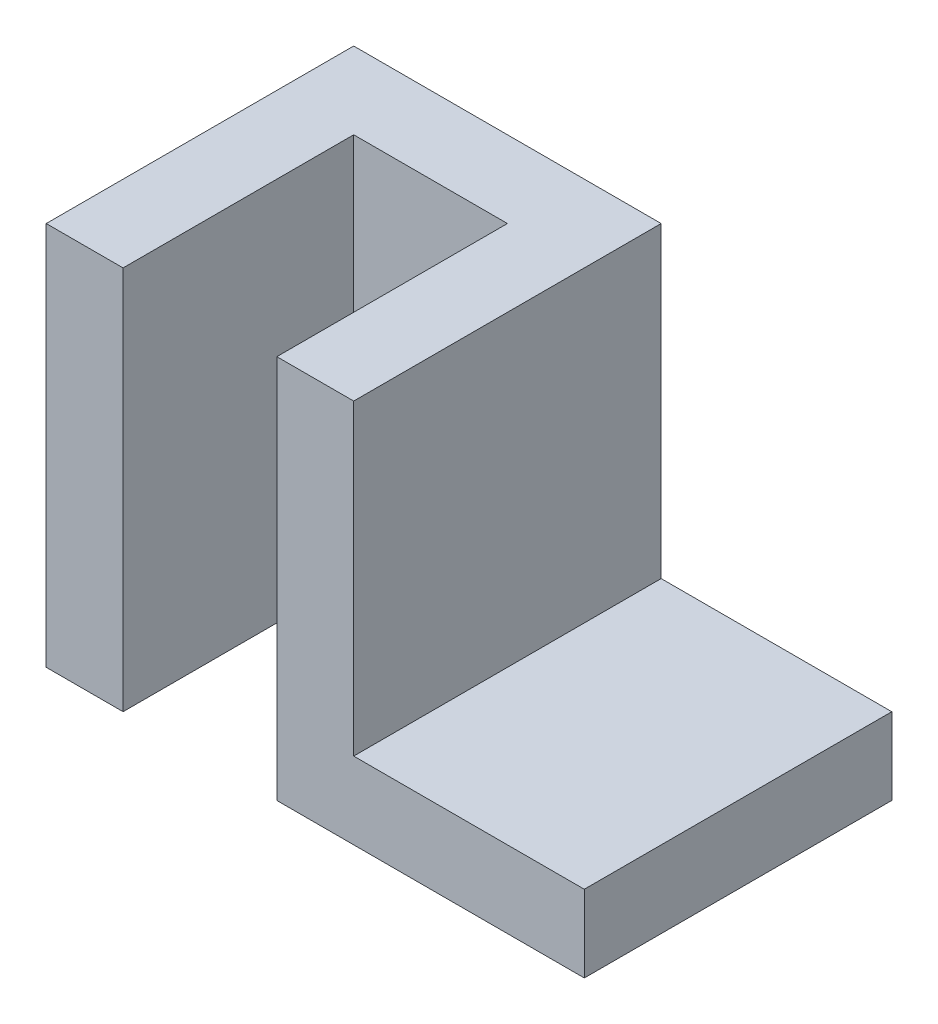
ISO-10303-21;
HEADER;
FILE_DESCRIPTION(('STEP AP214'),'2;1');
FILE_NAME('part.step','',(''),(''),'','','');
FILE_SCHEMA(('AUTOMOTIVE_DESIGN { 1 0 10303 214 1 1 1 1 }'));
ENDSEC;
DATA;
#1=APPLICATION_CONTEXT('core data for automotive mechanical design processes');
#2=APPLICATION_PROTOCOL_DEFINITION('international standard','automotive_design',2000,#1);
#3=PRODUCT_CONTEXT('',#1,'mechanical');
#4=PRODUCT('Part','Part','',(#3));
#5=PRODUCT_RELATED_PRODUCT_CATEGORY('part','',(#4));
#6=PRODUCT_DEFINITION_FORMATION('','',#4);
#7=PRODUCT_DEFINITION_CONTEXT('part definition',#1,'design');
#8=PRODUCT_DEFINITION('design','',#6,#7);
#9=PRODUCT_DEFINITION_SHAPE('','',#8);
#10=(LENGTH_UNIT() NAMED_UNIT(*) SI_UNIT(.MILLI.,.METRE.));
#11=(NAMED_UNIT(*) PLANE_ANGLE_UNIT() SI_UNIT($,.RADIAN.));
#12=(NAMED_UNIT(*) SI_UNIT($,.STERADIAN.) SOLID_ANGLE_UNIT());
#13=UNCERTAINTY_MEASURE_WITH_UNIT(LENGTH_MEASURE(1.E-05),#10,'distance_accuracy_value','');
#14=(GEOMETRIC_REPRESENTATION_CONTEXT(3) GLOBAL_UNCERTAINTY_ASSIGNED_CONTEXT((#13)) GLOBAL_UNIT_ASSIGNED_CONTEXT((#10,
#11,#12)) REPRESENTATION_CONTEXT('',''));
#15=CARTESIAN_POINT('',(0.,0.,0.));
#16=DIRECTION('',(0.,0.,1.));
#17=DIRECTION('',(1.,0.,0.));
#18=AXIS2_PLACEMENT_3D('',#15,#16,#17);
#19=CARTESIAN_POINT('',(-35.,10.,20.));
#20=DIRECTION('',(0.,0.,-1.));
#21=DIRECTION('',(-1.,0.,0.));
#22=AXIS2_PLACEMENT_3D('',#19,#20,#21);
#23=PLANE('',#22);
#24=DIRECTION('',(1.,0.,0.));
#25=VECTOR('',#24,1.);
#26=CARTESIAN_POINT('',(-35.,0.,20.));
#27=LINE('',#26,#25);
#28=CARTESIAN_POINT('',(-35.,0.,20.));
#29=VERTEX_POINT('',#28);
#30=CARTESIAN_POINT('',(-25.,0.,20.));
#31=VERTEX_POINT('',#30);
#32=EDGE_CURVE('E143',#29,#31,#27,.T.);
#33=ORIENTED_EDGE('',*,*,#32,.T.);
#34=DIRECTION('',(0.,1.,0.));
#35=VECTOR('',#34,1.);
#36=CARTESIAN_POINT('',(-25.,0.,20.));
#37=LINE('',#36,#35);
#38=CARTESIAN_POINT('',(-25.,50.,20.));
#39=VERTEX_POINT('',#38);
#40=EDGE_CURVE('E210',#31,#39,#37,.T.);
#41=ORIENTED_EDGE('',*,*,#40,.T.);
#42=DIRECTION('',(1.,0.,0.));
#43=VECTOR('',#42,1.);
#44=CARTESIAN_POINT('',(-35.,50.,20.));
#45=LINE('',#44,#43);
#46=CARTESIAN_POINT('',(-35.,50.,20.));
#47=VERTEX_POINT('',#46);
#48=EDGE_CURVE('E205',#47,#39,#45,.T.);
#49=ORIENTED_EDGE('',*,*,#48,.F.);
#50=DIRECTION('',(0.,-1.,0.));
#51=VECTOR('',#50,1.);
#52=CARTESIAN_POINT('',(-35.,10.,20.));
#53=LINE('',#52,#51);
#54=EDGE_CURVE('E11',#47,#29,#53,.T.);
#55=ORIENTED_EDGE('',*,*,#54,.T.);
#56=EDGE_LOOP('',(#33,#41,#49,#55));
#57=FACE_BOUND('',#56,.T.);
#58=ADVANCED_FACE('F39',(#57),#23,.F.);
#59=CARTESIAN_POINT('',(-35.,10.,-20.));
#60=DIRECTION('',(1.,0.,0.));
#61=DIRECTION('',(0.,0.,-1.));
#62=AXIS2_PLACEMENT_3D('',#59,#60,#61);
#63=PLANE('',#62);
#64=DIRECTION('',(0.,0.,1.));
#65=VECTOR('',#64,1.);
#66=CARTESIAN_POINT('',(-35.,0.,-20.));
#67=LINE('',#66,#65);
#68=CARTESIAN_POINT('',(-35.,0.,-20.));
#69=VERTEX_POINT('',#68);
#70=EDGE_CURVE('E144',#69,#29,#67,.T.);
#71=ORIENTED_EDGE('',*,*,#70,.T.);
#72=ORIENTED_EDGE('',*,*,#54,.F.);
#73=DIRECTION('',(0.,0.,1.));
#74=VECTOR('',#73,1.);
#75=CARTESIAN_POINT('',(-35.,50.,-20.));
#76=LINE('',#75,#74);
#77=CARTESIAN_POINT('',(-35.,50.,-20.));
#78=VERTEX_POINT('',#77);
#79=EDGE_CURVE('E209',#78,#47,#76,.T.);
#80=ORIENTED_EDGE('',*,*,#79,.F.);
#81=DIRECTION('',(0.,-1.,0.));
#82=VECTOR('',#81,1.);
#83=CARTESIAN_POINT('',(-35.,10.,-20.));
#84=LINE('',#83,#82);
#85=EDGE_CURVE('E160',#78,#69,#84,.T.);
#86=ORIENTED_EDGE('',*,*,#85,.T.);
#87=EDGE_LOOP('',(#71,#72,#80,#86));
#88=FACE_BOUND('',#87,.T.);
#89=ADVANCED_FACE('F41',(#88),#63,.F.);
#90=CARTESIAN_POINT('',(-5.,50.,20.));
#91=VERTEX_POINT('',#90);
#92=CARTESIAN_POINT('',(5.,50.,20.));
#93=VERTEX_POINT('',#92);
#94=EDGE_CURVE('E134',#91,#93,#45,.T.);
#95=ORIENTED_EDGE('',*,*,#94,.F.);
#96=DIRECTION('',(0.,1.,0.));
#97=VECTOR('',#96,1.);
#98=CARTESIAN_POINT('',(-5.,0.,20.));
#99=LINE('',#98,#97);
#100=CARTESIAN_POINT('',(-5.,0.,20.));
#101=VERTEX_POINT('',#100);
#102=EDGE_CURVE('E55',#101,#91,#99,.T.);
#103=ORIENTED_EDGE('',*,*,#102,.F.);
#104=CARTESIAN_POINT('',(35.,0.,20.));
#105=VERTEX_POINT('',#104);
#106=EDGE_CURVE('E131',#101,#105,#27,.T.);
#107=ORIENTED_EDGE('',*,*,#106,.T.);
#108=DIRECTION('',(0.,-1.,0.));
#109=VECTOR('',#108,1.);
#110=CARTESIAN_POINT('',(35.,10.,20.));
#111=LINE('',#110,#109);
#112=CARTESIAN_POINT('',(35.,10.,20.));
#113=VERTEX_POINT('',#112);
#114=EDGE_CURVE('E48',#113,#105,#111,.T.);
#115=ORIENTED_EDGE('',*,*,#114,.F.);
#116=DIRECTION('',(1.,0.,0.));
#117=VECTOR('',#116,1.);
#118=CARTESIAN_POINT('',(-35.,10.,20.));
#119=LINE('',#118,#117);
#120=CARTESIAN_POINT('',(5.,10.,20.));
#121=VERTEX_POINT('',#120);
#122=EDGE_CURVE('E159',#121,#113,#119,.T.);
#123=ORIENTED_EDGE('',*,*,#122,.F.);
#124=DIRECTION('',(0.,-1.,0.));
#125=VECTOR('',#124,1.);
#126=CARTESIAN_POINT('',(5.,50.,20.));
#127=LINE('',#126,#125);
#128=EDGE_CURVE('E150',#93,#121,#127,.T.);
#129=ORIENTED_EDGE('',*,*,#128,.F.);
#130=EDGE_LOOP('',(#95,#103,#107,#115,#123,#129));
#131=FACE_BOUND('',#130,.T.);
#132=ADVANCED_FACE('F129',(#131),#23,.F.);
#133=CARTESIAN_POINT('',(35.,10.,-20.));
#134=DIRECTION('',(-1.,0.,0.));
#135=DIRECTION('',(0.,0.,1.));
#136=AXIS2_PLACEMENT_3D('',#133,#134,#135);
#137=PLANE('',#136);
#138=DIRECTION('',(0.,0.,-1.));
#139=VECTOR('',#138,1.);
#140=CARTESIAN_POINT('',(35.,0.,-20.));
#141=LINE('',#140,#139);
#142=CARTESIAN_POINT('',(35.,0.,-20.));
#143=VERTEX_POINT('',#142);
#144=EDGE_CURVE('E141',#105,#143,#141,.T.);
#145=ORIENTED_EDGE('',*,*,#144,.T.);
#146=DIRECTION('',(0.,-1.,0.));
#147=VECTOR('',#146,1.);
#148=CARTESIAN_POINT('',(35.,10.,-20.));
#149=LINE('',#148,#147);
#150=CARTESIAN_POINT('',(35.,10.,-20.));
#151=VERTEX_POINT('',#150);
#152=EDGE_CURVE('E164',#151,#143,#149,.T.);
#153=ORIENTED_EDGE('',*,*,#152,.F.);
#154=DIRECTION('',(0.,0.,-1.));
#155=VECTOR('',#154,1.);
#156=CARTESIAN_POINT('',(35.,10.,-20.));
#157=LINE('',#156,#155);
#158=EDGE_CURVE('E173',#113,#151,#157,.T.);
#159=ORIENTED_EDGE('',*,*,#158,.F.);
#160=ORIENTED_EDGE('',*,*,#114,.T.);
#161=EDGE_LOOP('',(#145,#153,#159,#160));
#162=FACE_BOUND('',#161,.T.);
#163=ADVANCED_FACE('F171',(#162),#137,.F.);
#164=CARTESIAN_POINT('',(-35.,10.,-20.));
#165=DIRECTION('',(0.,0.,1.));
#166=DIRECTION('',(1.,0.,0.));
#167=AXIS2_PLACEMENT_3D('',#164,#165,#166);
#168=PLANE('',#167);
#169=DIRECTION('',(-1.,0.,0.));
#170=VECTOR('',#169,1.);
#171=CARTESIAN_POINT('',(-35.,0.,-20.));
#172=LINE('',#171,#170);
#173=EDGE_CURVE('E156',#143,#69,#172,.T.);
#174=ORIENTED_EDGE('',*,*,#173,.T.);
#175=ORIENTED_EDGE('',*,*,#85,.F.);
#176=DIRECTION('',(-1.,0.,0.));
#177=VECTOR('',#176,1.);
#178=CARTESIAN_POINT('',(-35.,50.,-20.));
#179=LINE('',#178,#177);
#180=CARTESIAN_POINT('',(5.,50.,-20.));
#181=VERTEX_POINT('',#180);
#182=EDGE_CURVE('E187',#181,#78,#179,.T.);
#183=ORIENTED_EDGE('',*,*,#182,.F.);
#184=DIRECTION('',(0.,-1.,0.));
#185=VECTOR('',#184,1.);
#186=CARTESIAN_POINT('',(5.,50.,-20.));
#187=LINE('',#186,#185);
#188=CARTESIAN_POINT('',(5.,10.,-20.));
#189=VERTEX_POINT('',#188);
#190=EDGE_CURVE('E184',#181,#189,#187,.T.);
#191=ORIENTED_EDGE('',*,*,#190,.T.);
#192=DIRECTION('',(-1.,0.,0.));
#193=VECTOR('',#192,1.);
#194=CARTESIAN_POINT('',(-35.,10.,-20.));
#195=LINE('',#194,#193);
#196=EDGE_CURVE('E165',#151,#189,#195,.T.);
#197=ORIENTED_EDGE('',*,*,#196,.F.);
#198=ORIENTED_EDGE('',*,*,#152,.T.);
#199=EDGE_LOOP('',(#174,#175,#183,#191,#197,#198));
#200=FACE_BOUND('',#199,.T.);
#201=ADVANCED_FACE('F196',(#200),#168,.F.);
#202=CARTESIAN_POINT('',(0.,10.,0.));
#203=DIRECTION('',(0.,1.,0.));
#204=DIRECTION('',(0.,0.,1.));
#205=AXIS2_PLACEMENT_3D('',#202,#203,#204);
#206=PLANE('',#205);
#207=DIRECTION('',(0.,0.,-1.));
#208=VECTOR('',#207,1.);
#209=CARTESIAN_POINT('',(5.,10.,-20.));
#210=LINE('',#209,#208);
#211=EDGE_CURVE('E63',#121,#189,#210,.T.);
#212=ORIENTED_EDGE('',*,*,#211,.F.);
#213=ORIENTED_EDGE('',*,*,#122,.T.);
#214=ORIENTED_EDGE('',*,*,#158,.T.);
#215=ORIENTED_EDGE('',*,*,#196,.T.);
#216=EDGE_LOOP('',(#212,#213,#214,#215));
#217=FACE_BOUND('',#216,.T.);
#218=ADVANCED_FACE('F194',(#217),#206,.T.);
#219=CARTESIAN_POINT('',(0.,0.,0.));
#220=DIRECTION('',(0.,1.,0.));
#221=DIRECTION('',(0.,0.,1.));
#222=AXIS2_PLACEMENT_3D('',#219,#220,#221);
#223=PLANE('',#222);
#224=DIRECTION('',(-1.,0.,0.));
#225=VECTOR('',#224,1.);
#226=CARTESIAN_POINT('',(-5.,0.,-10.));
#227=LINE('',#226,#225);
#228=CARTESIAN_POINT('',(-5.,0.,-10.));
#229=VERTEX_POINT('',#228);
#230=CARTESIAN_POINT('',(-25.,0.,-10.));
#231=VERTEX_POINT('',#230);
#232=EDGE_CURVE('E124',#229,#231,#227,.T.);
#233=ORIENTED_EDGE('',*,*,#232,.T.);
#234=DIRECTION('',(0.,0.,1.));
#235=VECTOR('',#234,1.);
#236=CARTESIAN_POINT('',(-25.,0.,-10.));
#237=LINE('',#236,#235);
#238=EDGE_CURVE('E136',#231,#31,#237,.T.);
#239=ORIENTED_EDGE('',*,*,#238,.T.);
#240=ORIENTED_EDGE('',*,*,#32,.F.);
#241=ORIENTED_EDGE('',*,*,#70,.F.);
#242=ORIENTED_EDGE('',*,*,#173,.F.);
#243=ORIENTED_EDGE('',*,*,#144,.F.);
#244=ORIENTED_EDGE('',*,*,#106,.F.);
#245=DIRECTION('',(0.,0.,-1.));
#246=VECTOR('',#245,1.);
#247=CARTESIAN_POINT('',(-5.,0.,20.));
#248=LINE('',#247,#246);
#249=EDGE_CURVE('E116',#101,#229,#248,.T.);
#250=ORIENTED_EDGE('',*,*,#249,.T.);
#251=EDGE_LOOP('',(#233,#239,#240,#241,#242,#243,#244,#250));
#252=FACE_BOUND('',#251,.T.);
#253=ADVANCED_FACE('F139',(#252),#223,.F.);
#254=CARTESIAN_POINT('',(5.,50.,-20.));
#255=DIRECTION('',(-1.,0.,0.));
#256=DIRECTION('',(0.,0.,1.));
#257=AXIS2_PLACEMENT_3D('',#254,#255,#256);
#258=PLANE('',#257);
#259=ORIENTED_EDGE('',*,*,#211,.T.);
#260=ORIENTED_EDGE('',*,*,#190,.F.);
#261=DIRECTION('',(0.,0.,-1.));
#262=VECTOR('',#261,1.);
#263=CARTESIAN_POINT('',(5.,50.,-20.));
#264=LINE('',#263,#262);
#265=EDGE_CURVE('E182',#93,#181,#264,.T.);
#266=ORIENTED_EDGE('',*,*,#265,.F.);
#267=ORIENTED_EDGE('',*,*,#128,.T.);
#268=EDGE_LOOP('',(#259,#260,#266,#267));
#269=FACE_BOUND('',#268,.T.);
#270=ADVANCED_FACE('F179',(#269),#258,.F.);
#271=CARTESIAN_POINT('',(0.,50.,0.));
#272=DIRECTION('',(0.,1.,0.));
#273=DIRECTION('',(0.,0.,1.));
#274=AXIS2_PLACEMENT_3D('',#271,#272,#273);
#275=PLANE('',#274);
#276=DIRECTION('',(0.,0.,1.));
#277=VECTOR('',#276,1.);
#278=CARTESIAN_POINT('',(-25.,50.,-10.));
#279=LINE('',#278,#277);
#280=CARTESIAN_POINT('',(-25.,50.,-10.));
#281=VERTEX_POINT('',#280);
#282=EDGE_CURVE('E125',#281,#39,#279,.T.);
#283=ORIENTED_EDGE('',*,*,#282,.F.);
#284=DIRECTION('',(-1.,0.,0.));
#285=VECTOR('',#284,1.);
#286=CARTESIAN_POINT('',(-5.,50.,-10.));
#287=LINE('',#286,#285);
#288=CARTESIAN_POINT('',(-5.,50.,-10.));
#289=VERTEX_POINT('',#288);
#290=EDGE_CURVE('E233',#289,#281,#287,.T.);
#291=ORIENTED_EDGE('',*,*,#290,.F.);
#292=DIRECTION('',(0.,0.,-1.));
#293=VECTOR('',#292,1.);
#294=CARTESIAN_POINT('',(-5.,50.,20.));
#295=LINE('',#294,#293);
#296=EDGE_CURVE('E231',#91,#289,#295,.T.);
#297=ORIENTED_EDGE('',*,*,#296,.F.);
#298=ORIENTED_EDGE('',*,*,#94,.T.);
#299=ORIENTED_EDGE('',*,*,#265,.T.);
#300=ORIENTED_EDGE('',*,*,#182,.T.);
#301=ORIENTED_EDGE('',*,*,#79,.T.);
#302=ORIENTED_EDGE('',*,*,#48,.T.);
#303=EDGE_LOOP('',(#283,#291,#297,#298,#299,#300,#301,#302));
#304=FACE_BOUND('',#303,.T.);
#305=ADVANCED_FACE('F229',(#304),#275,.T.);
#306=CARTESIAN_POINT('',(-25.,0.,-10.));
#307=DIRECTION('',(-1.,0.,0.));
#308=DIRECTION('',(0.,0.,1.));
#309=AXIS2_PLACEMENT_3D('',#306,#307,#308);
#310=PLANE('',#309);
#311=ORIENTED_EDGE('',*,*,#282,.T.);
#312=ORIENTED_EDGE('',*,*,#40,.F.);
#313=ORIENTED_EDGE('',*,*,#238,.F.);
#314=DIRECTION('',(0.,1.,0.));
#315=VECTOR('',#314,1.);
#316=CARTESIAN_POINT('',(-25.,0.,-10.));
#317=LINE('',#316,#315);
#318=EDGE_CURVE('E215',#231,#281,#317,.T.);
#319=ORIENTED_EDGE('',*,*,#318,.T.);
#320=EDGE_LOOP('',(#311,#312,#313,#319));
#321=FACE_BOUND('',#320,.T.);
#322=ADVANCED_FACE('F246',(#321),#310,.F.);
#323=CARTESIAN_POINT('',(-5.,0.,-10.));
#324=DIRECTION('',(0.,0.,-1.));
#325=DIRECTION('',(-1.,0.,0.));
#326=AXIS2_PLACEMENT_3D('',#323,#324,#325);
#327=PLANE('',#326);
#328=ORIENTED_EDGE('',*,*,#290,.T.);
#329=ORIENTED_EDGE('',*,*,#318,.F.);
#330=ORIENTED_EDGE('',*,*,#232,.F.);
#331=DIRECTION('',(0.,1.,0.));
#332=VECTOR('',#331,1.);
#333=CARTESIAN_POINT('',(-5.,0.,-10.));
#334=LINE('',#333,#332);
#335=EDGE_CURVE('E118',#229,#289,#334,.T.);
#336=ORIENTED_EDGE('',*,*,#335,.T.);
#337=EDGE_LOOP('',(#328,#329,#330,#336));
#338=FACE_BOUND('',#337,.T.);
#339=ADVANCED_FACE('F244',(#338),#327,.F.);
#340=CARTESIAN_POINT('',(-5.,0.,20.));
#341=DIRECTION('',(1.,0.,0.));
#342=DIRECTION('',(0.,0.,-1.));
#343=AXIS2_PLACEMENT_3D('',#340,#341,#342);
#344=PLANE('',#343);
#345=ORIENTED_EDGE('',*,*,#296,.T.);
#346=ORIENTED_EDGE('',*,*,#335,.F.);
#347=ORIENTED_EDGE('',*,*,#249,.F.);
#348=ORIENTED_EDGE('',*,*,#102,.T.);
#349=EDGE_LOOP('',(#345,#346,#347,#348));
#350=FACE_BOUND('',#349,.T.);
#351=ADVANCED_FACE('F117',(#350),#344,.F.);
#352=CLOSED_SHELL('',(#58,#89,#132,#163,#201,#218,#253,#270,#305,#322,#339,#351));
#353=MANIFOLD_SOLID_BREP('B2',#352);
#354=ADVANCED_BREP_SHAPE_REPRESENTATION('',(#18,#353),#14);
#355=SHAPE_DEFINITION_REPRESENTATION(#9,#354);
ENDSEC;
END-ISO-10303-21;
